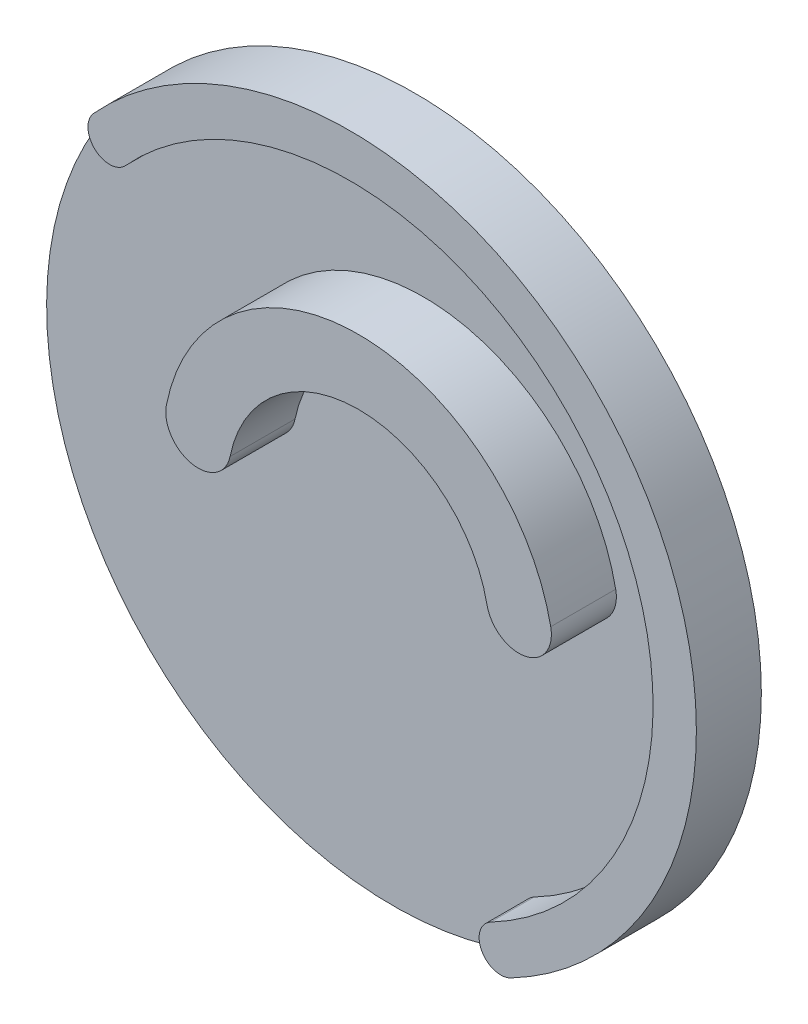
ISO-10303-21;
HEADER;
FILE_DESCRIPTION(('STEP AP214'),'2;1');
FILE_NAME('part.step','',(''),(''),'','','');
FILE_SCHEMA(('AUTOMOTIVE_DESIGN { 1 0 10303 214 1 1 1 1 }'));
ENDSEC;
DATA;
#1=APPLICATION_CONTEXT('core data for automotive mechanical design processes');
#2=APPLICATION_PROTOCOL_DEFINITION('international standard','automotive_design',2000,#1);
#3=PRODUCT_CONTEXT('',#1,'mechanical');
#4=PRODUCT('Part','Part','',(#3));
#5=PRODUCT_RELATED_PRODUCT_CATEGORY('part','',(#4));
#6=PRODUCT_DEFINITION_FORMATION('','',#4);
#7=PRODUCT_DEFINITION_CONTEXT('part definition',#1,'design');
#8=PRODUCT_DEFINITION('design','',#6,#7);
#9=PRODUCT_DEFINITION_SHAPE('','',#8);
#10=(LENGTH_UNIT() NAMED_UNIT(*) SI_UNIT(.MILLI.,.METRE.));
#11=(NAMED_UNIT(*) PLANE_ANGLE_UNIT() SI_UNIT($,.RADIAN.));
#12=(NAMED_UNIT(*) SI_UNIT($,.STERADIAN.) SOLID_ANGLE_UNIT());
#13=UNCERTAINTY_MEASURE_WITH_UNIT(LENGTH_MEASURE(1.E-05),#10,'distance_accuracy_value','');
#14=(GEOMETRIC_REPRESENTATION_CONTEXT(3) GLOBAL_UNCERTAINTY_ASSIGNED_CONTEXT((#13)) GLOBAL_UNIT_ASSIGNED_CONTEXT((#10,
#11,#12)) REPRESENTATION_CONTEXT('',''));
#15=CARTESIAN_POINT('',(0.,0.,0.));
#16=DIRECTION('',(0.,0.,1.));
#17=DIRECTION('',(1.,0.,0.));
#18=AXIS2_PLACEMENT_3D('',#15,#16,#17);
#19=CARTESIAN_POINT('',(24.6779253585061,4.,0.));
#20=DIRECTION('',(0.,0.,1.));
#21=DIRECTION('',(1.,0.,0.));
#22=AXIS2_PLACEMENT_3D('',#19,#20,#21);
#23=PLANE('',#22);
#24=CARTESIAN_POINT('',(26.0801805745358,4.,0.));
#25=DIRECTION('',(0.,0.,1.));
#26=DIRECTION('',(1.,0.,0.));
#27=AXIS2_PLACEMENT_3D('',#24,#25,#26);
#28=CIRCLE('',#27,9.05270695070576);
#29=CARTESIAN_POINT('',(34.9525554306513,5.79790643469753,0.));
#30=VERTEX_POINT('',#29);
#31=CARTESIAN_POINT('',(17.2078057184204,5.79790643469753,0.));
#32=VERTEX_POINT('',#31);
#33=EDGE_CURVE('E56',#30,#32,#28,.T.);
#34=ORIENTED_EDGE('',*,*,#33,.F.);
#35=CARTESIAN_POINT('',(33.4824357905656,5.5,0.));
#36=DIRECTION('',(0.,0.,1.));
#37=DIRECTION('',(1.,0.,0.));
#38=AXIS2_PLACEMENT_3D('',#35,#36,#37);
#39=CIRCLE('',#38,1.5);
#40=CARTESIAN_POINT('',(32.0123161504798,5.20209356530247,0.));
#41=VERTEX_POINT('',#40);
#42=EDGE_CURVE('E122',#41,#30,#39,.T.);
#43=ORIENTED_EDGE('',*,*,#42,.F.);
#44=CARTESIAN_POINT('',(26.0801805745358,4.,0.));
#45=DIRECTION('',(0.,0.,1.));
#46=DIRECTION('',(1.,0.,0.));
#47=AXIS2_PLACEMENT_3D('',#44,#45,#46);
#48=CIRCLE('',#47,6.05270695070576);
#49=CARTESIAN_POINT('',(20.1480449985919,5.20209356530247,0.));
#50=VERTEX_POINT('',#49);
#51=EDGE_CURVE('E133',#41,#50,#48,.T.);
#52=ORIENTED_EDGE('',*,*,#51,.T.);
#53=CARTESIAN_POINT('',(18.6779253585061,5.5,0.));
#54=DIRECTION('',(0.,0.,1.));
#55=DIRECTION('',(1.,0.,0.));
#56=AXIS2_PLACEMENT_3D('',#53,#54,#55);
#57=CIRCLE('',#56,1.5);
#58=EDGE_CURVE('E142',#32,#50,#57,.T.);
#59=ORIENTED_EDGE('',*,*,#58,.F.);
#60=EDGE_LOOP('',(#34,#43,#52,#59));
#61=FACE_BOUND('',#60,.T.);
#62=CARTESIAN_POINT('',(24.6779253585061,4.,0.));
#63=DIRECTION('',(0.,0.,1.));
#64=DIRECTION('',(1.,0.,0.));
#65=AXIS2_PLACEMENT_3D('',#62,#63,#64);
#66=CIRCLE('',#65,16.);
#67=CARTESIAN_POINT('',(12.8470140769406,14.7717008057096,0.));
#68=VERTEX_POINT('',#67);
#69=CARTESIAN_POINT('',(32.1112067335361,-10.1684977326333,0.));
#70=VERTEX_POINT('',#69);
#71=EDGE_CURVE('E37',#68,#70,#66,.T.);
#72=ORIENTED_EDGE('',*,*,#71,.T.);
#73=CARTESIAN_POINT('',(31.6466266475967,-9.28296662434367,0.));
#74=DIRECTION('',(0.,0.,1.));
#75=DIRECTION('',(1.,0.,0.));
#76=AXIS2_PLACEMENT_3D('',#73,#74,#75);
#77=CIRCLE('',#76,1.);
#78=CARTESIAN_POINT('',(31.1820465616573,-8.3974355160541,0.));
#79=VERTEX_POINT('',#78);
#80=EDGE_CURVE('E120',#79,#70,#77,.T.);
#81=ORIENTED_EDGE('',*,*,#80,.F.);
#82=CARTESIAN_POINT('',(24.6779253585061,4.,0.));
#83=DIRECTION('',(0.,0.,-1.));
#84=DIRECTION('',(1.,0.,0.));
#85=AXIS2_PLACEMENT_3D('',#82,#83,#84);
#86=CIRCLE('',#85,14.);
#87=CARTESIAN_POINT('',(14.3258779871362,13.4252382049959,0.));
#88=VERTEX_POINT('',#87);
#89=EDGE_CURVE('E116',#88,#79,#86,.T.);
#90=ORIENTED_EDGE('',*,*,#89,.F.);
#91=CARTESIAN_POINT('',(13.5864460320384,14.0984695053527,0.));
#92=DIRECTION('',(0.,0.,1.));
#93=DIRECTION('',(1.,0.,0.));
#94=AXIS2_PLACEMENT_3D('',#91,#92,#93);
#95=CIRCLE('',#94,1.);
#96=EDGE_CURVE('E160',#68,#88,#95,.T.);
#97=ORIENTED_EDGE('',*,*,#96,.F.);
#98=EDGE_LOOP('',(#72,#81,#90,#97));
#99=FACE_BOUND('',#98,.T.);
#100=ADVANCED_FACE('F33',(#61,#99),#23,.T.);
#101=CARTESIAN_POINT('',(24.6779253585061,4.,-1.));
#102=DIRECTION('',(0.,0.,1.));
#103=DIRECTION('',(1.,0.,0.));
#104=AXIS2_PLACEMENT_3D('',#101,#102,#103);
#105=CYLINDRICAL_SURFACE('',#104,16.);
#106=CARTESIAN_POINT('',(24.6779253585061,4.,-1.));
#107=DIRECTION('',(0.,0.,1.));
#108=DIRECTION('',(1.,0.,0.));
#109=AXIS2_PLACEMENT_3D('',#106,#107,#108);
#110=CIRCLE('',#109,16.);
#111=CARTESIAN_POINT('',(40.6779253585061,4.,-1.));
#112=VERTEX_POINT('',#111);
#113=EDGE_CURVE('E11',#112,#112,#110,.T.);
#114=ORIENTED_EDGE('',*,*,#113,.T.);
#115=EDGE_LOOP('',(#114));
#116=FACE_BOUND('',#115,.T.);
#117=ORIENTED_EDGE('',*,*,#71,.F.);
#118=DIRECTION('',(0.,0.,-1.));
#119=VECTOR('',#118,1.);
#120=CARTESIAN_POINT('',(12.8470140769406,14.7717008057096,2.));
#121=LINE('',#120,#119);
#122=CARTESIAN_POINT('',(12.8470140769406,14.7717008057096,2.));
#123=VERTEX_POINT('',#122);
#124=EDGE_CURVE('E104',#123,#68,#121,.T.);
#125=ORIENTED_EDGE('',*,*,#124,.F.);
#126=CARTESIAN_POINT('',(24.6779253585061,4.,2.));
#127=DIRECTION('',(0.,0.,1.));
#128=DIRECTION('',(1.,0.,0.));
#129=AXIS2_PLACEMENT_3D('',#126,#127,#128);
#130=CIRCLE('',#129,16.);
#131=CARTESIAN_POINT('',(32.1112067335361,-10.1684977326333,2.));
#132=VERTEX_POINT('',#131);
#133=EDGE_CURVE('E98',#132,#123,#130,.T.);
#134=ORIENTED_EDGE('',*,*,#133,.F.);
#135=DIRECTION('',(0.,0.,-1.));
#136=VECTOR('',#135,1.);
#137=CARTESIAN_POINT('',(32.1112067335361,-10.1684977326333,2.));
#138=LINE('',#137,#136);
#139=EDGE_CURVE('E102',#132,#70,#138,.T.);
#140=ORIENTED_EDGE('',*,*,#139,.T.);
#141=EDGE_LOOP('',(#117,#125,#134,#140));
#142=FACE_BOUND('',#141,.T.);
#143=ADVANCED_FACE('F35',(#116,#142),#105,.T.);
#144=CARTESIAN_POINT('',(24.6779253585061,4.,-1.));
#145=DIRECTION('',(0.,0.,1.));
#146=DIRECTION('',(1.,0.,0.));
#147=AXIS2_PLACEMENT_3D('',#144,#145,#146);
#148=PLANE('',#147);
#149=ORIENTED_EDGE('',*,*,#113,.F.);
#150=EDGE_LOOP('',(#149));
#151=FACE_BOUND('',#150,.T.);
#152=ADVANCED_FACE('F183',(#151),#148,.F.);
#153=CARTESIAN_POINT('',(33.4824357905656,5.5,3.));
#154=DIRECTION('',(0.,0.,-1.));
#155=DIRECTION('',(-1.,0.,0.));
#156=AXIS2_PLACEMENT_3D('',#153,#154,#155);
#157=CYLINDRICAL_SURFACE('',#156,1.5);
#158=ORIENTED_EDGE('',*,*,#42,.T.);
#159=DIRECTION('',(0.,0.,-1.));
#160=VECTOR('',#159,1.);
#161=CARTESIAN_POINT('',(34.9525554306513,5.79790643469753,3.));
#162=LINE('',#161,#160);
#163=CARTESIAN_POINT('',(34.9525554306513,5.79790643469753,3.));
#164=VERTEX_POINT('',#163);
#165=EDGE_CURVE('E154',#164,#30,#162,.T.);
#166=ORIENTED_EDGE('',*,*,#165,.F.);
#167=CARTESIAN_POINT('',(33.4824357905656,5.5,3.));
#168=DIRECTION('',(0.,0.,1.));
#169=DIRECTION('',(1.,0.,0.));
#170=AXIS2_PLACEMENT_3D('',#167,#168,#169);
#171=CIRCLE('',#170,1.5);
#172=CARTESIAN_POINT('',(32.0123161504798,5.20209356530247,3.));
#173=VERTEX_POINT('',#172);
#174=EDGE_CURVE('E129',#173,#164,#171,.T.);
#175=ORIENTED_EDGE('',*,*,#174,.F.);
#176=DIRECTION('',(0.,0.,-1.));
#177=VECTOR('',#176,1.);
#178=CARTESIAN_POINT('',(32.0123161504798,5.20209356530247,3.));
#179=LINE('',#178,#177);
#180=EDGE_CURVE('E139',#173,#41,#179,.T.);
#181=ORIENTED_EDGE('',*,*,#180,.T.);
#182=EDGE_LOOP('',(#158,#166,#175,#181));
#183=FACE_BOUND('',#182,.T.);
#184=ADVANCED_FACE('F188',(#183),#157,.T.);
#185=CARTESIAN_POINT('',(26.0801805745358,4.,3.));
#186=DIRECTION('',(0.,0.,-1.));
#187=DIRECTION('',(-1.,0.,0.));
#188=AXIS2_PLACEMENT_3D('',#185,#186,#187);
#189=CYLINDRICAL_SURFACE('',#188,9.05270695070576);
#190=ORIENTED_EDGE('',*,*,#33,.T.);
#191=DIRECTION('',(0.,0.,-1.));
#192=VECTOR('',#191,1.);
#193=CARTESIAN_POINT('',(17.2078057184204,5.79790643469753,3.));
#194=LINE('',#193,#192);
#195=CARTESIAN_POINT('',(17.2078057184204,5.79790643469753,3.));
#196=VERTEX_POINT('',#195);
#197=EDGE_CURVE('E151',#196,#32,#194,.T.);
#198=ORIENTED_EDGE('',*,*,#197,.F.);
#199=CARTESIAN_POINT('',(26.0801805745358,4.,3.));
#200=DIRECTION('',(0.,0.,1.));
#201=DIRECTION('',(1.,0.,0.));
#202=AXIS2_PLACEMENT_3D('',#199,#200,#201);
#203=CIRCLE('',#202,9.05270695070576);
#204=EDGE_CURVE('E132',#164,#196,#203,.T.);
#205=ORIENTED_EDGE('',*,*,#204,.F.);
#206=ORIENTED_EDGE('',*,*,#165,.T.);
#207=EDGE_LOOP('',(#190,#198,#205,#206));
#208=FACE_BOUND('',#207,.T.);
#209=ADVANCED_FACE('F192',(#208),#189,.T.);
#210=CARTESIAN_POINT('',(18.6779253585061,5.5,3.));
#211=DIRECTION('',(0.,0.,-1.));
#212=DIRECTION('',(-1.,0.,0.));
#213=AXIS2_PLACEMENT_3D('',#210,#211,#212);
#214=CYLINDRICAL_SURFACE('',#213,1.5);
#215=ORIENTED_EDGE('',*,*,#58,.T.);
#216=DIRECTION('',(0.,0.,-1.));
#217=VECTOR('',#216,1.);
#218=CARTESIAN_POINT('',(20.1480449985919,5.20209356530247,3.));
#219=LINE('',#218,#217);
#220=CARTESIAN_POINT('',(20.1480449985919,5.20209356530247,3.));
#221=VERTEX_POINT('',#220);
#222=EDGE_CURVE('E148',#221,#50,#219,.T.);
#223=ORIENTED_EDGE('',*,*,#222,.F.);
#224=CARTESIAN_POINT('',(18.6779253585061,5.5,3.));
#225=DIRECTION('',(0.,0.,1.));
#226=DIRECTION('',(1.,0.,0.));
#227=AXIS2_PLACEMENT_3D('',#224,#225,#226);
#228=CIRCLE('',#227,1.5);
#229=EDGE_CURVE('E135',#196,#221,#228,.T.);
#230=ORIENTED_EDGE('',*,*,#229,.F.);
#231=ORIENTED_EDGE('',*,*,#197,.T.);
#232=EDGE_LOOP('',(#215,#223,#230,#231));
#233=FACE_BOUND('',#232,.T.);
#234=ADVANCED_FACE('F196',(#233),#214,.T.);
#235=CARTESIAN_POINT('',(26.0801805745358,4.,3.));
#236=DIRECTION('',(0.,0.,-1.));
#237=DIRECTION('',(-1.,0.,0.));
#238=AXIS2_PLACEMENT_3D('',#235,#236,#237);
#239=CYLINDRICAL_SURFACE('',#238,6.05270695070576);
#240=ORIENTED_EDGE('',*,*,#51,.F.);
#241=ORIENTED_EDGE('',*,*,#180,.F.);
#242=CARTESIAN_POINT('',(26.0801805745358,4.,3.));
#243=DIRECTION('',(0.,0.,1.));
#244=DIRECTION('',(1.,0.,0.));
#245=AXIS2_PLACEMENT_3D('',#242,#243,#244);
#246=CIRCLE('',#245,6.05270695070576);
#247=EDGE_CURVE('E137',#173,#221,#246,.T.);
#248=ORIENTED_EDGE('',*,*,#247,.T.);
#249=ORIENTED_EDGE('',*,*,#222,.T.);
#250=EDGE_LOOP('',(#240,#241,#248,#249));
#251=FACE_BOUND('',#250,.T.);
#252=ADVANCED_FACE('F199',(#251),#239,.F.);
#253=CARTESIAN_POINT('',(29.7813081825507,4.75,3.));
#254=DIRECTION('',(0.,0.,1.));
#255=DIRECTION('',(1.,0.,0.));
#256=AXIS2_PLACEMENT_3D('',#253,#254,#255);
#257=PLANE('',#256);
#258=ORIENTED_EDGE('',*,*,#174,.T.);
#259=ORIENTED_EDGE('',*,*,#204,.T.);
#260=ORIENTED_EDGE('',*,*,#229,.T.);
#261=ORIENTED_EDGE('',*,*,#247,.F.);
#262=EDGE_LOOP('',(#258,#259,#260,#261));
#263=FACE_BOUND('',#262,.T.);
#264=ADVANCED_FACE('F203',(#263),#257,.T.);
#265=CARTESIAN_POINT('',(31.6466266475967,-9.28296662434367,2.));
#266=DIRECTION('',(0.,0.,-1.));
#267=DIRECTION('',(-1.,0.,0.));
#268=AXIS2_PLACEMENT_3D('',#265,#266,#267);
#269=CYLINDRICAL_SURFACE('',#268,1.);
#270=ORIENTED_EDGE('',*,*,#80,.T.);
#271=ORIENTED_EDGE('',*,*,#139,.F.);
#272=CARTESIAN_POINT('',(31.6466266475967,-9.28296662434367,2.));
#273=DIRECTION('',(0.,0.,1.));
#274=DIRECTION('',(1.,0.,0.));
#275=AXIS2_PLACEMENT_3D('',#272,#273,#274);
#276=CIRCLE('',#275,1.);
#277=CARTESIAN_POINT('',(31.1820465616573,-8.3974355160541,2.));
#278=VERTEX_POINT('',#277);
#279=EDGE_CURVE('E108',#278,#132,#276,.T.);
#280=ORIENTED_EDGE('',*,*,#279,.F.);
#281=DIRECTION('',(0.,0.,-1.));
#282=VECTOR('',#281,1.);
#283=CARTESIAN_POINT('',(31.1820465616573,-8.3974355160541,2.));
#284=LINE('',#283,#282);
#285=EDGE_CURVE('E167',#278,#79,#284,.T.);
#286=ORIENTED_EDGE('',*,*,#285,.T.);
#287=EDGE_LOOP('',(#270,#271,#280,#286));
#288=FACE_BOUND('',#287,.T.);
#289=ADVANCED_FACE('F118',(#288),#269,.T.);
#290=CARTESIAN_POINT('',(13.5864460320384,14.0984695053527,2.));
#291=DIRECTION('',(0.,0.,-1.));
#292=DIRECTION('',(-1.,0.,0.));
#293=AXIS2_PLACEMENT_3D('',#290,#291,#292);
#294=CYLINDRICAL_SURFACE('',#293,1.);
#295=ORIENTED_EDGE('',*,*,#96,.T.);
#296=DIRECTION('',(0.,0.,-1.));
#297=VECTOR('',#296,1.);
#298=CARTESIAN_POINT('',(14.3258779871363,13.4252382049959,2.));
#299=LINE('',#298,#297);
#300=CARTESIAN_POINT('',(14.3258779871363,13.4252382049959,2.));
#301=VERTEX_POINT('',#300);
#302=EDGE_CURVE('E48',#301,#88,#299,.T.);
#303=ORIENTED_EDGE('',*,*,#302,.F.);
#304=CARTESIAN_POINT('',(13.5864460320384,14.0984695053527,2.));
#305=DIRECTION('',(0.,0.,1.));
#306=DIRECTION('',(1.,0.,0.));
#307=AXIS2_PLACEMENT_3D('',#304,#305,#306);
#308=CIRCLE('',#307,1.);
#309=EDGE_CURVE('E107',#123,#301,#308,.T.);
#310=ORIENTED_EDGE('',*,*,#309,.F.);
#311=ORIENTED_EDGE('',*,*,#124,.T.);
#312=EDGE_LOOP('',(#295,#303,#310,#311));
#313=FACE_BOUND('',#312,.T.);
#314=ADVANCED_FACE('F169',(#313),#294,.T.);
#315=CARTESIAN_POINT('',(24.6779253585061,4.,2.));
#316=DIRECTION('',(0.,0.,-1.));
#317=DIRECTION('',(-1.,0.,0.));
#318=AXIS2_PLACEMENT_3D('',#315,#316,#317);
#319=CYLINDRICAL_SURFACE('',#318,14.);
#320=ORIENTED_EDGE('',*,*,#89,.T.);
#321=ORIENTED_EDGE('',*,*,#285,.F.);
#322=CARTESIAN_POINT('',(24.6779253585061,4.,2.));
#323=DIRECTION('',(0.,0.,-1.));
#324=DIRECTION('',(1.,0.,0.));
#325=AXIS2_PLACEMENT_3D('',#322,#323,#324);
#326=CIRCLE('',#325,14.);
#327=EDGE_CURVE('E112',#301,#278,#326,.T.);
#328=ORIENTED_EDGE('',*,*,#327,.F.);
#329=ORIENTED_EDGE('',*,*,#302,.T.);
#330=EDGE_LOOP('',(#320,#321,#328,#329));
#331=FACE_BOUND('',#330,.T.);
#332=ADVANCED_FACE('F170',(#331),#319,.F.);
#333=CARTESIAN_POINT('',(28.1622760030514,-2.64148331217183,2.));
#334=DIRECTION('',(0.,0.,1.));
#335=DIRECTION('',(1.,0.,0.));
#336=AXIS2_PLACEMENT_3D('',#333,#334,#335);
#337=PLANE('',#336);
#338=ORIENTED_EDGE('',*,*,#279,.T.);
#339=ORIENTED_EDGE('',*,*,#133,.T.);
#340=ORIENTED_EDGE('',*,*,#309,.T.);
#341=ORIENTED_EDGE('',*,*,#327,.T.);
#342=EDGE_LOOP('',(#338,#339,#340,#341));
#343=FACE_BOUND('',#342,.T.);
#344=ADVANCED_FACE('F111',(#343),#337,.T.);
#345=CLOSED_SHELL('',(#100,#143,#152,#184,#209,#234,#252,#264,#289,#314,#332,#344));
#346=MANIFOLD_SOLID_BREP('B2',#345);
#347=ADVANCED_BREP_SHAPE_REPRESENTATION('',(#18,#346),#14);
#348=SHAPE_DEFINITION_REPRESENTATION(#9,#347);
ENDSEC;
END-ISO-10303-21;
